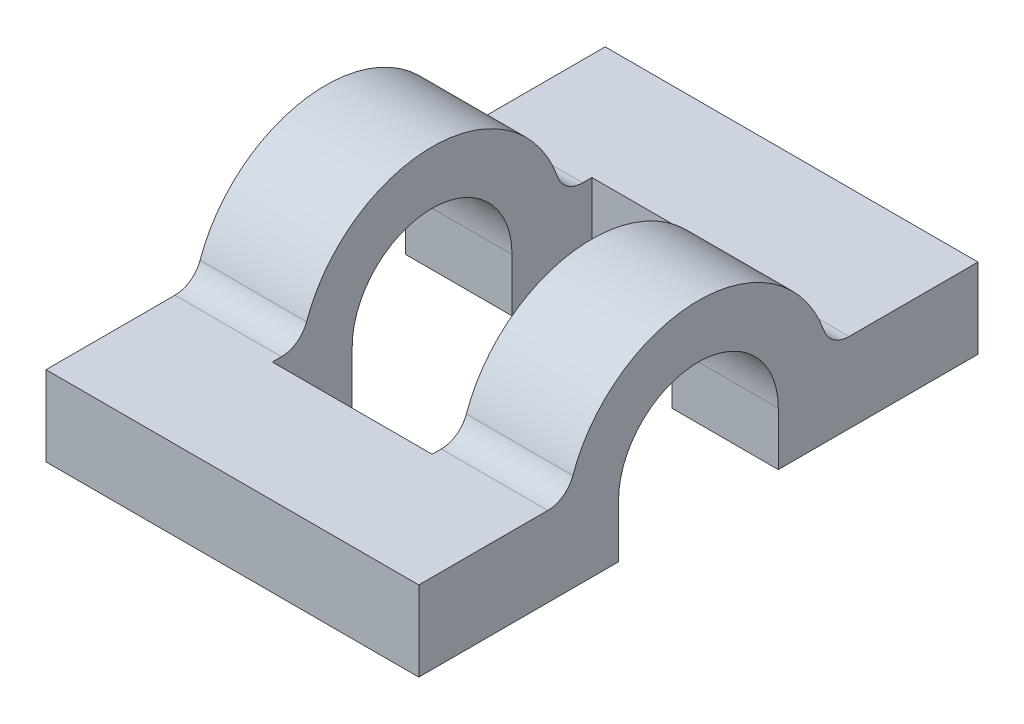
ISO-10303-21;
HEADER;
FILE_DESCRIPTION(('STEP AP214'),'2;1');
FILE_NAME('part.step','',(''),(''),'','','');
FILE_SCHEMA(('AUTOMOTIVE_DESIGN { 1 0 10303 214 1 1 1 1 }'));
ENDSEC;
DATA;
#1=APPLICATION_CONTEXT('core data for automotive mechanical design processes');
#2=APPLICATION_PROTOCOL_DEFINITION('international standard','automotive_design',2000,#1);
#3=PRODUCT_CONTEXT('',#1,'mechanical');
#4=PRODUCT('Part','Part','',(#3));
#5=PRODUCT_RELATED_PRODUCT_CATEGORY('part','',(#4));
#6=PRODUCT_DEFINITION_FORMATION('','',#4);
#7=PRODUCT_DEFINITION_CONTEXT('part definition',#1,'design');
#8=PRODUCT_DEFINITION('design','',#6,#7);
#9=PRODUCT_DEFINITION_SHAPE('','',#8);
#10=(LENGTH_UNIT() NAMED_UNIT(*) SI_UNIT(.MILLI.,.METRE.));
#11=(NAMED_UNIT(*) PLANE_ANGLE_UNIT() SI_UNIT($,.RADIAN.));
#12=(NAMED_UNIT(*) SI_UNIT($,.STERADIAN.) SOLID_ANGLE_UNIT());
#13=UNCERTAINTY_MEASURE_WITH_UNIT(LENGTH_MEASURE(1.E-05),#10,'distance_accuracy_value','');
#14=(GEOMETRIC_REPRESENTATION_CONTEXT(3) GLOBAL_UNCERTAINTY_ASSIGNED_CONTEXT((#13)) GLOBAL_UNIT_ASSIGNED_CONTEXT((#10,
#11,#12)) REPRESENTATION_CONTEXT('',''));
#15=CARTESIAN_POINT('',(0.,0.,0.));
#16=DIRECTION('',(0.,0.,1.));
#17=DIRECTION('',(1.,0.,0.));
#18=AXIS2_PLACEMENT_3D('',#15,#16,#17);
#19=CARTESIAN_POINT('',(14.,2.,0.));
#20=DIRECTION('',(-1.,0.,0.));
#21=DIRECTION('',(0.,0.,1.));
#22=AXIS2_PLACEMENT_3D('',#19,#20,#21);
#23=CYLINDRICAL_SURFACE('',#22,5.);
#24=CARTESIAN_POINT('',(10.,2.,0.));
#25=DIRECTION('',(1.,0.,0.));
#26=DIRECTION('',(0.,0.,-1.));
#27=AXIS2_PLACEMENT_3D('',#24,#25,#26);
#28=CIRCLE('',#27,5.);
#29=CARTESIAN_POINT('',(10.,3.66666666666667,-4.71404520791032));
#30=VERTEX_POINT('',#29);
#31=CARTESIAN_POINT('',(10.,3.66666666666667,4.71404520791032));
#32=VERTEX_POINT('',#31);
#33=EDGE_CURVE('E246',#30,#32,#28,.T.);
#34=ORIENTED_EDGE('',*,*,#33,.T.);
#35=DIRECTION('',(-1.,0.,0.));
#36=VECTOR('',#35,1.);
#37=CARTESIAN_POINT('',(14.,3.66666666666667,4.71404520791032));
#38=LINE('',#37,#36);
#39=CARTESIAN_POINT('',(14.,3.66666666666667,4.71404520791032));
#40=VERTEX_POINT('',#39);
#41=EDGE_CURVE('E360',#32,#40,#38,.F.);
#42=ORIENTED_EDGE('',*,*,#41,.T.);
#43=CARTESIAN_POINT('',(14.,2.,0.));
#44=DIRECTION('',(1.,0.,0.));
#45=DIRECTION('',(0.,0.,1.));
#46=AXIS2_PLACEMENT_3D('',#43,#44,#45);
#47=CIRCLE('',#46,5.);
#48=CARTESIAN_POINT('',(14.,3.66666666666667,-4.71404520791032));
#49=VERTEX_POINT('',#48);
#50=EDGE_CURVE('E277',#49,#40,#47,.T.);
#51=ORIENTED_EDGE('',*,*,#50,.F.);
#52=DIRECTION('',(-1.,0.,0.));
#53=VECTOR('',#52,1.);
#54=CARTESIAN_POINT('',(14.,3.66666666666667,-4.71404520791032));
#55=LINE('',#54,#53);
#56=EDGE_CURVE('E357',#49,#30,#55,.T.);
#57=ORIENTED_EDGE('',*,*,#56,.T.);
#58=EDGE_LOOP('',(#34,#42,#51,#57));
#59=FACE_BOUND('',#58,.T.);
#60=ADVANCED_FACE('F35',(#59),#23,.T.);
#61=CARTESIAN_POINT('',(14.,0.,3.));
#62=DIRECTION('',(0.,0.,1.));
#63=DIRECTION('',(1.,0.,0.));
#64=AXIS2_PLACEMENT_3D('',#61,#62,#63);
#65=PLANE('',#64);
#66=DIRECTION('',(-1.,0.,0.));
#67=VECTOR('',#66,1.);
#68=CARTESIAN_POINT('',(14.,2.,3.));
#69=LINE('',#68,#67);
#70=CARTESIAN_POINT('',(4.,2.,3.));
#71=VERTEX_POINT('',#70);
#72=CARTESIAN_POINT('',(0.,2.,3.));
#73=VERTEX_POINT('',#72);
#74=EDGE_CURVE('E327',#71,#73,#69,.T.);
#75=ORIENTED_EDGE('',*,*,#74,.F.);
#76=DIRECTION('',(0.,-1.,0.));
#77=VECTOR('',#76,1.);
#78=CARTESIAN_POINT('',(4.,0.,3.));
#79=LINE('',#78,#77);
#80=CARTESIAN_POINT('',(4.,0.,3.));
#81=VERTEX_POINT('',#80);
#82=EDGE_CURVE('E256',#71,#81,#79,.T.);
#83=ORIENTED_EDGE('',*,*,#82,.T.);
#84=DIRECTION('',(-1.,0.,0.));
#85=VECTOR('',#84,1.);
#86=CARTESIAN_POINT('',(14.,0.,3.));
#87=LINE('',#86,#85);
#88=CARTESIAN_POINT('',(0.,0.,3.));
#89=VERTEX_POINT('',#88);
#90=EDGE_CURVE('E331',#81,#89,#87,.T.);
#91=ORIENTED_EDGE('',*,*,#90,.T.);
#92=DIRECTION('',(0.,1.,0.));
#93=VECTOR('',#92,1.);
#94=CARTESIAN_POINT('',(0.,0.,3.));
#95=LINE('',#94,#93);
#96=EDGE_CURVE('E309',#89,#73,#95,.T.);
#97=ORIENTED_EDGE('',*,*,#96,.T.);
#98=EDGE_LOOP('',(#75,#83,#91,#97));
#99=FACE_BOUND('',#98,.T.);
#100=ADVANCED_FACE('F449',(#99),#65,.F.);
#101=CARTESIAN_POINT('',(14.,2.,0.));
#102=DIRECTION('',(-1.,0.,0.));
#103=DIRECTION('',(0.,0.,1.));
#104=AXIS2_PLACEMENT_3D('',#101,#102,#103);
#105=CYLINDRICAL_SURFACE('',#104,3.);
#106=DIRECTION('',(-1.,0.,0.));
#107=VECTOR('',#106,1.);
#108=CARTESIAN_POINT('',(14.,2.,-3.));
#109=LINE('',#108,#107);
#110=CARTESIAN_POINT('',(4.,2.,-3.));
#111=VERTEX_POINT('',#110);
#112=CARTESIAN_POINT('',(0.,2.,-3.));
#113=VERTEX_POINT('',#112);
#114=EDGE_CURVE('E323',#111,#113,#109,.T.);
#115=ORIENTED_EDGE('',*,*,#114,.F.);
#116=CARTESIAN_POINT('',(4.,2.,0.));
#117=DIRECTION('',(-1.,0.,0.));
#118=DIRECTION('',(0.,0.,1.));
#119=AXIS2_PLACEMENT_3D('',#116,#117,#118);
#120=CIRCLE('',#119,3.);
#121=EDGE_CURVE('E253',#111,#71,#120,.F.);
#122=ORIENTED_EDGE('',*,*,#121,.T.);
#123=ORIENTED_EDGE('',*,*,#74,.T.);
#124=CARTESIAN_POINT('',(0.,2.,0.));
#125=DIRECTION('',(-1.,0.,0.));
#126=DIRECTION('',(0.,0.,1.));
#127=AXIS2_PLACEMENT_3D('',#124,#125,#126);
#128=CIRCLE('',#127,3.);
#129=EDGE_CURVE('E312',#73,#113,#128,.T.);
#130=ORIENTED_EDGE('',*,*,#129,.T.);
#131=EDGE_LOOP('',(#115,#122,#123,#130));
#132=FACE_BOUND('',#131,.T.);
#133=ADVANCED_FACE('F457',(#132),#105,.F.);
#134=CARTESIAN_POINT('',(14.,0.,-3.));
#135=DIRECTION('',(0.,0.,-1.));
#136=DIRECTION('',(-1.,0.,0.));
#137=AXIS2_PLACEMENT_3D('',#134,#135,#136);
#138=PLANE('',#137);
#139=DIRECTION('',(-1.,0.,0.));
#140=VECTOR('',#139,1.);
#141=CARTESIAN_POINT('',(14.,0.,-3.));
#142=LINE('',#141,#140);
#143=CARTESIAN_POINT('',(4.,0.,-3.));
#144=VERTEX_POINT('',#143);
#145=CARTESIAN_POINT('',(0.,0.,-3.));
#146=VERTEX_POINT('',#145);
#147=EDGE_CURVE('E321',#144,#146,#142,.T.);
#148=ORIENTED_EDGE('',*,*,#147,.F.);
#149=DIRECTION('',(0.,1.,0.));
#150=VECTOR('',#149,1.);
#151=CARTESIAN_POINT('',(4.,0.,-3.));
#152=LINE('',#151,#150);
#153=EDGE_CURVE('E250',#144,#111,#152,.T.);
#154=ORIENTED_EDGE('',*,*,#153,.T.);
#155=ORIENTED_EDGE('',*,*,#114,.T.);
#156=DIRECTION('',(0.,-1.,0.));
#157=VECTOR('',#156,1.);
#158=CARTESIAN_POINT('',(0.,0.,-3.));
#159=LINE('',#158,#157);
#160=EDGE_CURVE('E315',#113,#146,#159,.T.);
#161=ORIENTED_EDGE('',*,*,#160,.T.);
#162=EDGE_LOOP('',(#148,#154,#155,#161));
#163=FACE_BOUND('',#162,.T.);
#164=ADVANCED_FACE('F460',(#163),#138,.F.);
#165=CARTESIAN_POINT('',(14.,0.,-10.5));
#166=DIRECTION('',(0.,0.,1.));
#167=DIRECTION('',(0.,-1.,0.));
#168=AXIS2_PLACEMENT_3D('',#165,#166,#167);
#169=PLANE('',#168);
#170=DIRECTION('',(0.,1.,0.));
#171=VECTOR('',#170,1.);
#172=CARTESIAN_POINT('',(0.,0.,-10.5));
#173=LINE('',#172,#171);
#174=CARTESIAN_POINT('',(0.,0.,-10.5));
#175=VERTEX_POINT('',#174);
#176=CARTESIAN_POINT('',(0.,3.,-10.5));
#177=VERTEX_POINT('',#176);
#178=EDGE_CURVE('E270',#175,#177,#173,.T.);
#179=ORIENTED_EDGE('',*,*,#178,.T.);
#180=DIRECTION('',(-1.,0.,0.));
#181=VECTOR('',#180,1.);
#182=CARTESIAN_POINT('',(14.,3.,-10.5));
#183=LINE('',#182,#181);
#184=CARTESIAN_POINT('',(14.,3.,-10.5));
#185=VERTEX_POINT('',#184);
#186=EDGE_CURVE('E341',#185,#177,#183,.T.);
#187=ORIENTED_EDGE('',*,*,#186,.F.);
#188=DIRECTION('',(0.,1.,0.));
#189=VECTOR('',#188,1.);
#190=CARTESIAN_POINT('',(14.,0.,-10.5));
#191=LINE('',#190,#189);
#192=CARTESIAN_POINT('',(14.,0.,-10.5));
#193=VERTEX_POINT('',#192);
#194=EDGE_CURVE('E271',#193,#185,#191,.T.);
#195=ORIENTED_EDGE('',*,*,#194,.F.);
#196=DIRECTION('',(-1.,0.,0.));
#197=VECTOR('',#196,1.);
#198=CARTESIAN_POINT('',(14.,0.,-10.5));
#199=LINE('',#198,#197);
#200=EDGE_CURVE('E294',#193,#175,#199,.T.);
#201=ORIENTED_EDGE('',*,*,#200,.T.);
#202=EDGE_LOOP('',(#179,#187,#195,#201));
#203=FACE_BOUND('',#202,.T.);
#204=ADVANCED_FACE('F424',(#203),#169,.F.);
#205=CARTESIAN_POINT('',(14.,3.,-10.5));
#206=DIRECTION('',(0.,-1.,0.));
#207=DIRECTION('',(0.,0.,-1.));
#208=AXIS2_PLACEMENT_3D('',#205,#206,#207);
#209=PLANE('',#208);
#210=DIRECTION('',(0.,0.,1.));
#211=VECTOR('',#210,1.);
#212=CARTESIAN_POINT('',(0.,3.,-10.5));
#213=LINE('',#212,#211);
#214=CARTESIAN_POINT('',(0.,3.,-5.65685424949238));
#215=VERTEX_POINT('',#214);
#216=EDGE_CURVE('E297',#177,#215,#213,.T.);
#217=ORIENTED_EDGE('',*,*,#216,.T.);
#218=DIRECTION('',(1.,0.,0.));
#219=VECTOR('',#218,1.);
#220=CARTESIAN_POINT('',(4.,3.,-5.65685424949238));
#221=LINE('',#220,#219);
#222=CARTESIAN_POINT('',(4.,3.,-5.65685424949238));
#223=VERTEX_POINT('',#222);
#224=EDGE_CURVE('E363',#215,#223,#221,.T.);
#225=ORIENTED_EDGE('',*,*,#224,.T.);
#226=DIRECTION('',(0.,0.,-1.));
#227=VECTOR('',#226,1.);
#228=CARTESIAN_POINT('',(4.,3.,-10.5));
#229=LINE('',#228,#227);
#230=CARTESIAN_POINT('',(4.,3.,-6.));
#231=VERTEX_POINT('',#230);
#232=EDGE_CURVE('E265',#223,#231,#229,.T.);
#233=ORIENTED_EDGE('',*,*,#232,.T.);
#234=DIRECTION('',(1.,0.,0.));
#235=VECTOR('',#234,1.);
#236=CARTESIAN_POINT('',(14.,3.,-6.));
#237=LINE('',#236,#235);
#238=CARTESIAN_POINT('',(10.,3.,-6.));
#239=VERTEX_POINT('',#238);
#240=EDGE_CURVE('E232',#231,#239,#237,.T.);
#241=ORIENTED_EDGE('',*,*,#240,.T.);
#242=DIRECTION('',(0.,0.,1.));
#243=VECTOR('',#242,1.);
#244=CARTESIAN_POINT('',(10.,3.,-10.5));
#245=LINE('',#244,#243);
#246=CARTESIAN_POINT('',(10.,3.,-5.65685424949238));
#247=VERTEX_POINT('',#246);
#248=EDGE_CURVE('E201',#239,#247,#245,.T.);
#249=ORIENTED_EDGE('',*,*,#248,.T.);
#250=DIRECTION('',(1.,0.,0.));
#251=VECTOR('',#250,1.);
#252=CARTESIAN_POINT('',(14.,3.,-5.65685424949238));
#253=LINE('',#252,#251);
#254=CARTESIAN_POINT('',(14.,3.,-5.65685424949238));
#255=VERTEX_POINT('',#254);
#256=EDGE_CURVE('E58',#247,#255,#253,.T.);
#257=ORIENTED_EDGE('',*,*,#256,.T.);
#258=DIRECTION('',(0.,0.,1.));
#259=VECTOR('',#258,1.);
#260=CARTESIAN_POINT('',(14.,3.,-10.5));
#261=LINE('',#260,#259);
#262=EDGE_CURVE('E274',#185,#255,#261,.T.);
#263=ORIENTED_EDGE('',*,*,#262,.F.);
#264=ORIENTED_EDGE('',*,*,#186,.T.);
#265=EDGE_LOOP('',(#217,#225,#233,#241,#249,#257,#263,#264));
#266=FACE_BOUND('',#265,.T.);
#267=ADVANCED_FACE('F378',(#266),#209,.F.);
#268=CARTESIAN_POINT('',(0.,2.,0.));
#269=DIRECTION('',(1.,0.,0.));
#270=DIRECTION('',(0.,0.,1.));
#271=AXIS2_PLACEMENT_3D('',#268,#269,#270);
#272=CIRCLE('',#271,5.);
#273=CARTESIAN_POINT('',(0.,3.66666666666667,-4.71404520791032));
#274=VERTEX_POINT('',#273);
#275=CARTESIAN_POINT('',(0.,3.66666666666667,4.71404520791032));
#276=VERTEX_POINT('',#275);
#277=EDGE_CURVE('E299',#274,#276,#272,.T.);
#278=ORIENTED_EDGE('',*,*,#277,.T.);
#279=DIRECTION('',(-1.,0.,0.));
#280=VECTOR('',#279,1.);
#281=CARTESIAN_POINT('',(14.,3.66666666666667,4.71404520791032));
#282=LINE('',#281,#280);
#283=CARTESIAN_POINT('',(4.,3.66666666666667,4.71404520791032));
#284=VERTEX_POINT('',#283);
#285=EDGE_CURVE('E355',#276,#284,#282,.F.);
#286=ORIENTED_EDGE('',*,*,#285,.T.);
#287=CARTESIAN_POINT('',(4.,2.,0.));
#288=DIRECTION('',(-1.,0.,0.));
#289=DIRECTION('',(0.,0.,1.));
#290=AXIS2_PLACEMENT_3D('',#287,#288,#289);
#291=CIRCLE('',#290,5.);
#292=CARTESIAN_POINT('',(4.,3.66666666666667,-4.71404520791032));
#293=VERTEX_POINT('',#292);
#294=EDGE_CURVE('E262',#284,#293,#291,.T.);
#295=ORIENTED_EDGE('',*,*,#294,.T.);
#296=DIRECTION('',(-1.,0.,0.));
#297=VECTOR('',#296,1.);
#298=CARTESIAN_POINT('',(14.,3.66666666666667,-4.71404520791032));
#299=LINE('',#298,#297);
#300=EDGE_CURVE('E352',#293,#274,#299,.T.);
#301=ORIENTED_EDGE('',*,*,#300,.T.);
#302=EDGE_LOOP('',(#278,#286,#295,#301));
#303=FACE_BOUND('',#302,.T.);
#304=ADVANCED_FACE('F436',(#303),#23,.T.);
#305=CARTESIAN_POINT('',(14.,3.,4.89897948556636));
#306=DIRECTION('',(0.,-1.,0.));
#307=DIRECTION('',(0.,0.,-1.));
#308=AXIS2_PLACEMENT_3D('',#305,#306,#307);
#309=PLANE('',#308);
#310=DIRECTION('',(0.,0.,-1.));
#311=VECTOR('',#310,1.);
#312=CARTESIAN_POINT('',(4.,3.,4.89897948556635));
#313=LINE('',#312,#311);
#314=CARTESIAN_POINT('',(4.,3.,6.));
#315=VERTEX_POINT('',#314);
#316=CARTESIAN_POINT('',(4.,3.,5.65685424949238));
#317=VERTEX_POINT('',#316);
#318=EDGE_CURVE('E259',#315,#317,#313,.T.);
#319=ORIENTED_EDGE('',*,*,#318,.T.);
#320=DIRECTION('',(1.,0.,0.));
#321=VECTOR('',#320,1.);
#322=CARTESIAN_POINT('',(0.,3.,5.65685424949238));
#323=LINE('',#322,#321);
#324=CARTESIAN_POINT('',(0.,3.,5.65685424949238));
#325=VERTEX_POINT('',#324);
#326=EDGE_CURVE('E349',#317,#325,#323,.F.);
#327=ORIENTED_EDGE('',*,*,#326,.T.);
#328=DIRECTION('',(0.,0.,1.));
#329=VECTOR('',#328,1.);
#330=CARTESIAN_POINT('',(0.,3.,4.89897948556636));
#331=LINE('',#330,#329);
#332=CARTESIAN_POINT('',(0.,3.,10.5));
#333=VERTEX_POINT('',#332);
#334=EDGE_CURVE('E302',#325,#333,#331,.T.);
#335=ORIENTED_EDGE('',*,*,#334,.T.);
#336=DIRECTION('',(-1.,0.,0.));
#337=VECTOR('',#336,1.);
#338=CARTESIAN_POINT('',(14.,3.,10.5));
#339=LINE('',#338,#337);
#340=CARTESIAN_POINT('',(14.,3.,10.5));
#341=VERTEX_POINT('',#340);
#342=EDGE_CURVE('E338',#341,#333,#339,.T.);
#343=ORIENTED_EDGE('',*,*,#342,.F.);
#344=DIRECTION('',(0.,0.,1.));
#345=VECTOR('',#344,1.);
#346=CARTESIAN_POINT('',(14.,3.,4.89897948556636));
#347=LINE('',#346,#345);
#348=CARTESIAN_POINT('',(14.,3.,5.65685424949238));
#349=VERTEX_POINT('',#348);
#350=EDGE_CURVE('E280',#349,#341,#347,.T.);
#351=ORIENTED_EDGE('',*,*,#350,.F.);
#352=DIRECTION('',(1.,0.,0.));
#353=VECTOR('',#352,1.);
#354=CARTESIAN_POINT('',(10.,3.,5.65685424949238));
#355=LINE('',#354,#353);
#356=CARTESIAN_POINT('',(10.,3.,5.65685424949238));
#357=VERTEX_POINT('',#356);
#358=EDGE_CURVE('E346',#349,#357,#355,.F.);
#359=ORIENTED_EDGE('',*,*,#358,.T.);
#360=DIRECTION('',(0.,0.,1.));
#361=VECTOR('',#360,1.);
#362=CARTESIAN_POINT('',(10.,3.,4.89897948556636));
#363=LINE('',#362,#361);
#364=CARTESIAN_POINT('',(10.,3.,6.));
#365=VERTEX_POINT('',#364);
#366=EDGE_CURVE('E244',#357,#365,#363,.T.);
#367=ORIENTED_EDGE('',*,*,#366,.T.);
#368=DIRECTION('',(-1.,0.,0.));
#369=VECTOR('',#368,1.);
#370=CARTESIAN_POINT('',(14.,3.,6.));
#371=LINE('',#370,#369);
#372=EDGE_CURVE('E267',#365,#315,#371,.T.);
#373=ORIENTED_EDGE('',*,*,#372,.T.);
#374=EDGE_LOOP('',(#319,#327,#335,#343,#351,#359,#367,#373));
#375=FACE_BOUND('',#374,.T.);
#376=ADVANCED_FACE('F392',(#375),#309,.F.);
#377=CARTESIAN_POINT('',(14.,3.,10.5));
#378=DIRECTION('',(0.,0.,-1.));
#379=DIRECTION('',(-1.,0.,0.));
#380=AXIS2_PLACEMENT_3D('',#377,#378,#379);
#381=PLANE('',#380);
#382=DIRECTION('',(0.,-1.,0.));
#383=VECTOR('',#382,1.);
#384=CARTESIAN_POINT('',(0.,3.,10.5));
#385=LINE('',#384,#383);
#386=CARTESIAN_POINT('',(0.,0.,10.5));
#387=VERTEX_POINT('',#386);
#388=EDGE_CURVE('E304',#333,#387,#385,.T.);
#389=ORIENTED_EDGE('',*,*,#388,.T.);
#390=DIRECTION('',(-1.,0.,0.));
#391=VECTOR('',#390,1.);
#392=CARTESIAN_POINT('',(14.,0.,10.5));
#393=LINE('',#392,#391);
#394=CARTESIAN_POINT('',(14.,0.,10.5));
#395=VERTEX_POINT('',#394);
#396=EDGE_CURVE('E335',#395,#387,#393,.T.);
#397=ORIENTED_EDGE('',*,*,#396,.F.);
#398=DIRECTION('',(0.,-1.,0.));
#399=VECTOR('',#398,1.);
#400=CARTESIAN_POINT('',(14.,3.,10.5));
#401=LINE('',#400,#399);
#402=EDGE_CURVE('E282',#341,#395,#401,.T.);
#403=ORIENTED_EDGE('',*,*,#402,.F.);
#404=ORIENTED_EDGE('',*,*,#342,.T.);
#405=EDGE_LOOP('',(#389,#397,#403,#404));
#406=FACE_BOUND('',#405,.T.);
#407=ADVANCED_FACE('F399',(#406),#381,.F.);
#408=CARTESIAN_POINT('',(14.,0.,10.5));
#409=DIRECTION('',(0.,1.,0.));
#410=DIRECTION('',(0.,0.,1.));
#411=AXIS2_PLACEMENT_3D('',#408,#409,#410);
#412=PLANE('',#411);
#413=ORIENTED_EDGE('',*,*,#90,.F.);
#414=DIRECTION('',(0.,0.,-1.));
#415=VECTOR('',#414,1.);
#416=CARTESIAN_POINT('',(4.,0.,6.));
#417=LINE('',#416,#415);
#418=CARTESIAN_POINT('',(4.,0.,6.));
#419=VERTEX_POINT('',#418);
#420=EDGE_CURVE('E216',#419,#81,#417,.T.);
#421=ORIENTED_EDGE('',*,*,#420,.F.);
#422=DIRECTION('',(-1.,0.,0.));
#423=VECTOR('',#422,1.);
#424=CARTESIAN_POINT('',(4.,0.,6.));
#425=LINE('',#424,#423);
#426=CARTESIAN_POINT('',(10.,0.,6.));
#427=VERTEX_POINT('',#426);
#428=EDGE_CURVE('E223',#427,#419,#425,.T.);
#429=ORIENTED_EDGE('',*,*,#428,.F.);
#430=DIRECTION('',(0.,0.,1.));
#431=VECTOR('',#430,1.);
#432=CARTESIAN_POINT('',(10.,0.,6.));
#433=LINE('',#432,#431);
#434=CARTESIAN_POINT('',(10.,0.,3.));
#435=VERTEX_POINT('',#434);
#436=EDGE_CURVE('E215',#435,#427,#433,.T.);
#437=ORIENTED_EDGE('',*,*,#436,.F.);
#438=CARTESIAN_POINT('',(14.,0.,3.));
#439=VERTEX_POINT('',#438);
#440=EDGE_CURVE('E332',#439,#435,#87,.T.);
#441=ORIENTED_EDGE('',*,*,#440,.F.);
#442=DIRECTION('',(0.,0.,-1.));
#443=VECTOR('',#442,1.);
#444=CARTESIAN_POINT('',(14.,0.,10.5));
#445=LINE('',#444,#443);
#446=EDGE_CURVE('E284',#395,#439,#445,.T.);
#447=ORIENTED_EDGE('',*,*,#446,.F.);
#448=ORIENTED_EDGE('',*,*,#396,.T.);
#449=DIRECTION('',(0.,0.,-1.));
#450=VECTOR('',#449,1.);
#451=CARTESIAN_POINT('',(0.,0.,10.5));
#452=LINE('',#451,#450);
#453=EDGE_CURVE('E306',#387,#89,#452,.T.);
#454=ORIENTED_EDGE('',*,*,#453,.T.);
#455=EDGE_LOOP('',(#413,#421,#429,#437,#441,#447,#448,#454));
#456=FACE_BOUND('',#455,.T.);
#457=ADVANCED_FACE('F407',(#456),#412,.F.);
#458=ORIENTED_EDGE('',*,*,#440,.T.);
#459=DIRECTION('',(0.,1.,0.));
#460=VECTOR('',#459,1.);
#461=CARTESIAN_POINT('',(10.,0.,3.));
#462=LINE('',#461,#460);
#463=CARTESIAN_POINT('',(10.,2.,3.));
#464=VERTEX_POINT('',#463);
#465=EDGE_CURVE('E241',#435,#464,#462,.T.);
#466=ORIENTED_EDGE('',*,*,#465,.T.);
#467=CARTESIAN_POINT('',(14.,2.,3.));
#468=VERTEX_POINT('',#467);
#469=EDGE_CURVE('E328',#468,#464,#69,.T.);
#470=ORIENTED_EDGE('',*,*,#469,.F.);
#471=DIRECTION('',(0.,1.,0.));
#472=VECTOR('',#471,1.);
#473=CARTESIAN_POINT('',(14.,0.,3.));
#474=LINE('',#473,#472);
#475=EDGE_CURVE('E286',#439,#468,#474,.T.);
#476=ORIENTED_EDGE('',*,*,#475,.F.);
#477=EDGE_LOOP('',(#458,#466,#470,#476));
#478=FACE_BOUND('',#477,.T.);
#479=ADVANCED_FACE('F410',(#478),#65,.F.);
#480=ORIENTED_EDGE('',*,*,#469,.T.);
#481=CARTESIAN_POINT('',(10.,2.,0.));
#482=DIRECTION('',(1.,0.,0.));
#483=DIRECTION('',(0.,0.,-1.));
#484=AXIS2_PLACEMENT_3D('',#481,#482,#483);
#485=CIRCLE('',#484,3.);
#486=CARTESIAN_POINT('',(10.,2.,-3.));
#487=VERTEX_POINT('',#486);
#488=EDGE_CURVE('E238',#464,#487,#485,.F.);
#489=ORIENTED_EDGE('',*,*,#488,.T.);
#490=CARTESIAN_POINT('',(14.,2.,-3.));
#491=VERTEX_POINT('',#490);
#492=EDGE_CURVE('E324',#491,#487,#109,.T.);
#493=ORIENTED_EDGE('',*,*,#492,.F.);
#494=CARTESIAN_POINT('',(14.,2.,0.));
#495=DIRECTION('',(-1.,0.,0.));
#496=DIRECTION('',(0.,0.,1.));
#497=AXIS2_PLACEMENT_3D('',#494,#495,#496);
#498=CIRCLE('',#497,3.);
#499=EDGE_CURVE('E288',#468,#491,#498,.T.);
#500=ORIENTED_EDGE('',*,*,#499,.F.);
#501=EDGE_LOOP('',(#480,#489,#493,#500));
#502=FACE_BOUND('',#501,.T.);
#503=ADVANCED_FACE('F414',(#502),#105,.F.);
#504=ORIENTED_EDGE('',*,*,#492,.T.);
#505=DIRECTION('',(0.,-1.,0.));
#506=VECTOR('',#505,1.);
#507=CARTESIAN_POINT('',(10.,0.,-3.));
#508=LINE('',#507,#506);
#509=CARTESIAN_POINT('',(10.,0.,-3.));
#510=VERTEX_POINT('',#509);
#511=EDGE_CURVE('E236',#487,#510,#508,.T.);
#512=ORIENTED_EDGE('',*,*,#511,.T.);
#513=CARTESIAN_POINT('',(14.,0.,-3.));
#514=VERTEX_POINT('',#513);
#515=EDGE_CURVE('E222',#514,#510,#142,.T.);
#516=ORIENTED_EDGE('',*,*,#515,.F.);
#517=DIRECTION('',(0.,-1.,0.));
#518=VECTOR('',#517,1.);
#519=CARTESIAN_POINT('',(14.,0.,-3.));
#520=LINE('',#519,#518);
#521=EDGE_CURVE('E290',#491,#514,#520,.T.);
#522=ORIENTED_EDGE('',*,*,#521,.F.);
#523=EDGE_LOOP('',(#504,#512,#516,#522));
#524=FACE_BOUND('',#523,.T.);
#525=ADVANCED_FACE('F418',(#524),#138,.F.);
#526=CARTESIAN_POINT('',(14.,0.,-10.5));
#527=DIRECTION('',(0.,1.,0.));
#528=DIRECTION('',(0.,0.,1.));
#529=AXIS2_PLACEMENT_3D('',#526,#527,#528);
#530=PLANE('',#529);
#531=DIRECTION('',(1.,0.,0.));
#532=VECTOR('',#531,1.);
#533=CARTESIAN_POINT('',(4.,0.,-6.));
#534=LINE('',#533,#532);
#535=CARTESIAN_POINT('',(4.,0.,-6.));
#536=VERTEX_POINT('',#535);
#537=CARTESIAN_POINT('',(10.,0.,-6.));
#538=VERTEX_POINT('',#537);
#539=EDGE_CURVE('E209',#536,#538,#534,.T.);
#540=ORIENTED_EDGE('',*,*,#539,.F.);
#541=DIRECTION('',(0.,0.,1.));
#542=VECTOR('',#541,1.);
#543=CARTESIAN_POINT('',(4.,0.,-10.5));
#544=LINE('',#543,#542);
#545=EDGE_CURVE('E344',#536,#144,#544,.T.);
#546=ORIENTED_EDGE('',*,*,#545,.T.);
#547=ORIENTED_EDGE('',*,*,#147,.T.);
#548=DIRECTION('',(0.,0.,-1.));
#549=VECTOR('',#548,1.);
#550=CARTESIAN_POINT('',(0.,0.,-10.5));
#551=LINE('',#550,#549);
#552=EDGE_CURVE('E275',#146,#175,#551,.T.);
#553=ORIENTED_EDGE('',*,*,#552,.T.);
#554=ORIENTED_EDGE('',*,*,#200,.F.);
#555=DIRECTION('',(0.,0.,-1.));
#556=VECTOR('',#555,1.);
#557=CARTESIAN_POINT('',(14.,0.,-10.5));
#558=LINE('',#557,#556);
#559=EDGE_CURVE('E292',#514,#193,#558,.T.);
#560=ORIENTED_EDGE('',*,*,#559,.F.);
#561=ORIENTED_EDGE('',*,*,#515,.T.);
#562=EDGE_CURVE('E199',#538,#510,#433,.T.);
#563=ORIENTED_EDGE('',*,*,#562,.F.);
#564=EDGE_LOOP('',(#540,#546,#547,#553,#554,#560,#561,#563));
#565=FACE_BOUND('',#564,.T.);
#566=ADVANCED_FACE('F219',(#565),#530,.F.);
#567=CARTESIAN_POINT('',(14.,2.,0.));
#568=DIRECTION('',(-1.,0.,0.));
#569=DIRECTION('',(0.,0.,1.));
#570=AXIS2_PLACEMENT_3D('',#567,#568,#569);
#571=PLANE('',#570);
#572=ORIENTED_EDGE('',*,*,#194,.T.);
#573=ORIENTED_EDGE('',*,*,#262,.T.);
#574=CARTESIAN_POINT('',(14.,4.,-5.65685424949238));
#575=DIRECTION('',(-1.,0.,0.));
#576=DIRECTION('',(0.,0.,1.));
#577=AXIS2_PLACEMENT_3D('',#574,#575,#576);
#578=CIRCLE('',#577,1.);
#579=EDGE_CURVE('E11',#255,#49,#578,.T.);
#580=ORIENTED_EDGE('',*,*,#579,.T.);
#581=ORIENTED_EDGE('',*,*,#50,.T.);
#582=CARTESIAN_POINT('',(14.,4.,5.65685424949238));
#583=DIRECTION('',(-1.,0.,0.));
#584=DIRECTION('',(0.,0.,1.));
#585=AXIS2_PLACEMENT_3D('',#582,#583,#584);
#586=CIRCLE('',#585,1.);
#587=EDGE_CURVE('E371',#40,#349,#586,.T.);
#588=ORIENTED_EDGE('',*,*,#587,.T.);
#589=ORIENTED_EDGE('',*,*,#350,.T.);
#590=ORIENTED_EDGE('',*,*,#402,.T.);
#591=ORIENTED_EDGE('',*,*,#446,.T.);
#592=ORIENTED_EDGE('',*,*,#475,.T.);
#593=ORIENTED_EDGE('',*,*,#499,.T.);
#594=ORIENTED_EDGE('',*,*,#521,.T.);
#595=ORIENTED_EDGE('',*,*,#559,.T.);
#596=EDGE_LOOP('',(#572,#573,#580,#581,#588,#589,#590,#591,#592,#593,#594,#595));
#597=FACE_BOUND('',#596,.T.);
#598=ADVANCED_FACE('F382',(#597),#571,.F.);
#599=CARTESIAN_POINT('',(0.,2.,0.));
#600=DIRECTION('',(-1.,0.,0.));
#601=DIRECTION('',(0.,0.,1.));
#602=AXIS2_PLACEMENT_3D('',#599,#600,#601);
#603=PLANE('',#602);
#604=ORIENTED_EDGE('',*,*,#178,.F.);
#605=ORIENTED_EDGE('',*,*,#552,.F.);
#606=ORIENTED_EDGE('',*,*,#160,.F.);
#607=ORIENTED_EDGE('',*,*,#129,.F.);
#608=ORIENTED_EDGE('',*,*,#96,.F.);
#609=ORIENTED_EDGE('',*,*,#453,.F.);
#610=ORIENTED_EDGE('',*,*,#388,.F.);
#611=ORIENTED_EDGE('',*,*,#334,.F.);
#612=CARTESIAN_POINT('',(0.,4.,5.65685424949238));
#613=DIRECTION('',(-1.,0.,0.));
#614=DIRECTION('',(0.,0.,1.));
#615=AXIS2_PLACEMENT_3D('',#612,#613,#614);
#616=CIRCLE('',#615,1.);
#617=EDGE_CURVE('E365',#325,#276,#616,.F.);
#618=ORIENTED_EDGE('',*,*,#617,.T.);
#619=ORIENTED_EDGE('',*,*,#277,.F.);
#620=CARTESIAN_POINT('',(0.,4.,-5.65685424949238));
#621=DIRECTION('',(-1.,0.,0.));
#622=DIRECTION('',(0.,0.,1.));
#623=AXIS2_PLACEMENT_3D('',#620,#621,#622);
#624=CIRCLE('',#623,1.);
#625=EDGE_CURVE('E50',#274,#215,#624,.F.);
#626=ORIENTED_EDGE('',*,*,#625,.T.);
#627=ORIENTED_EDGE('',*,*,#216,.F.);
#628=EDGE_LOOP('',(#604,#605,#606,#607,#608,#609,#610,#611,#618,#619,#626,#627));
#629=FACE_BOUND('',#628,.T.);
#630=ADVANCED_FACE('F453',(#629),#603,.T.);
#631=CARTESIAN_POINT('',(4.,7.,6.));
#632=DIRECTION('',(0.,0.,1.));
#633=DIRECTION('',(1.,0.,0.));
#634=AXIS2_PLACEMENT_3D('',#631,#632,#633);
#635=PLANE('',#634);
#636=DIRECTION('',(0.,-1.,0.));
#637=VECTOR('',#636,1.);
#638=CARTESIAN_POINT('',(10.,7.,6.));
#639=LINE('',#638,#637);
#640=EDGE_CURVE('E205',#365,#427,#639,.T.);
#641=ORIENTED_EDGE('',*,*,#640,.T.);
#642=ORIENTED_EDGE('',*,*,#428,.T.);
#643=DIRECTION('',(0.,-1.,0.));
#644=VECTOR('',#643,1.);
#645=CARTESIAN_POINT('',(4.,7.,6.));
#646=LINE('',#645,#644);
#647=EDGE_CURVE('E230',#315,#419,#646,.T.);
#648=ORIENTED_EDGE('',*,*,#647,.F.);
#649=ORIENTED_EDGE('',*,*,#372,.F.);
#650=EDGE_LOOP('',(#641,#642,#648,#649));
#651=FACE_BOUND('',#650,.T.);
#652=ADVANCED_FACE('F445',(#651),#635,.F.);
#653=CARTESIAN_POINT('',(4.,7.,6.));
#654=DIRECTION('',(-1.,0.,0.));
#655=DIRECTION('',(0.,0.,1.));
#656=AXIS2_PLACEMENT_3D('',#653,#654,#655);
#657=PLANE('',#656);
#658=ORIENTED_EDGE('',*,*,#294,.F.);
#659=CARTESIAN_POINT('',(4.,4.,5.65685424949238));
#660=DIRECTION('',(-1.,0.,0.));
#661=DIRECTION('',(0.,0.,1.));
#662=AXIS2_PLACEMENT_3D('',#659,#660,#661);
#663=CIRCLE('',#662,1.);
#664=EDGE_CURVE('E367',#284,#317,#663,.T.);
#665=ORIENTED_EDGE('',*,*,#664,.T.);
#666=ORIENTED_EDGE('',*,*,#318,.F.);
#667=ORIENTED_EDGE('',*,*,#647,.T.);
#668=ORIENTED_EDGE('',*,*,#420,.T.);
#669=ORIENTED_EDGE('',*,*,#82,.F.);
#670=ORIENTED_EDGE('',*,*,#121,.F.);
#671=ORIENTED_EDGE('',*,*,#153,.F.);
#672=ORIENTED_EDGE('',*,*,#545,.F.);
#673=DIRECTION('',(0.,-1.,0.));
#674=VECTOR('',#673,1.);
#675=CARTESIAN_POINT('',(4.,7.,-6.));
#676=LINE('',#675,#674);
#677=EDGE_CURVE('E206',#231,#536,#676,.T.);
#678=ORIENTED_EDGE('',*,*,#677,.F.);
#679=ORIENTED_EDGE('',*,*,#232,.F.);
#680=CARTESIAN_POINT('',(4.,4.,-5.65685424949238));
#681=DIRECTION('',(-1.,0.,0.));
#682=DIRECTION('',(0.,0.,1.));
#683=AXIS2_PLACEMENT_3D('',#680,#681,#682);
#684=CIRCLE('',#683,1.);
#685=EDGE_CURVE('E374',#223,#293,#684,.T.);
#686=ORIENTED_EDGE('',*,*,#685,.T.);
#687=EDGE_LOOP('',(#658,#665,#666,#667,#668,#669,#670,#671,#672,#678,#679,#686));
#688=FACE_BOUND('',#687,.T.);
#689=ADVANCED_FACE('F433',(#688),#657,.F.);
#690=CARTESIAN_POINT('',(10.,7.,6.));
#691=DIRECTION('',(1.,0.,0.));
#692=DIRECTION('',(0.,0.,-1.));
#693=AXIS2_PLACEMENT_3D('',#690,#691,#692);
#694=PLANE('',#693);
#695=DIRECTION('',(0.,-1.,0.));
#696=VECTOR('',#695,1.);
#697=CARTESIAN_POINT('',(10.,7.,-6.));
#698=LINE('',#697,#696);
#699=EDGE_CURVE('E195',#239,#538,#698,.T.);
#700=ORIENTED_EDGE('',*,*,#699,.T.);
#701=ORIENTED_EDGE('',*,*,#562,.T.);
#702=ORIENTED_EDGE('',*,*,#511,.F.);
#703=ORIENTED_EDGE('',*,*,#488,.F.);
#704=ORIENTED_EDGE('',*,*,#465,.F.);
#705=ORIENTED_EDGE('',*,*,#436,.T.);
#706=ORIENTED_EDGE('',*,*,#640,.F.);
#707=ORIENTED_EDGE('',*,*,#366,.F.);
#708=CARTESIAN_POINT('',(10.,4.,5.65685424949238));
#709=DIRECTION('',(1.,0.,0.));
#710=DIRECTION('',(0.,0.,-1.));
#711=AXIS2_PLACEMENT_3D('',#708,#709,#710);
#712=CIRCLE('',#711,1.);
#713=EDGE_CURVE('E369',#357,#32,#712,.T.);
#714=ORIENTED_EDGE('',*,*,#713,.T.);
#715=ORIENTED_EDGE('',*,*,#33,.F.);
#716=CARTESIAN_POINT('',(10.,4.,-5.65685424949238));
#717=DIRECTION('',(1.,0.,0.));
#718=DIRECTION('',(0.,0.,-1.));
#719=AXIS2_PLACEMENT_3D('',#716,#717,#718);
#720=CIRCLE('',#719,1.);
#721=EDGE_CURVE('E43',#30,#247,#720,.T.);
#722=ORIENTED_EDGE('',*,*,#721,.T.);
#723=ORIENTED_EDGE('',*,*,#248,.F.);
#724=EDGE_LOOP('',(#700,#701,#702,#703,#704,#705,#706,#707,#714,#715,#722,#723));
#725=FACE_BOUND('',#724,.T.);
#726=ADVANCED_FACE('F197',(#725),#694,.F.);
#727=CARTESIAN_POINT('',(4.,7.,-6.));
#728=DIRECTION('',(0.,0.,-1.));
#729=DIRECTION('',(0.,1.,0.));
#730=AXIS2_PLACEMENT_3D('',#727,#728,#729);
#731=PLANE('',#730);
#732=ORIENTED_EDGE('',*,*,#677,.T.);
#733=ORIENTED_EDGE('',*,*,#539,.T.);
#734=ORIENTED_EDGE('',*,*,#699,.F.);
#735=ORIENTED_EDGE('',*,*,#240,.F.);
#736=EDGE_LOOP('',(#732,#733,#734,#735));
#737=FACE_BOUND('',#736,.T.);
#738=ADVANCED_FACE('F210',(#737),#731,.F.);
#739=CARTESIAN_POINT('',(14.,4.,5.65685424949238));
#740=DIRECTION('',(-1.,0.,0.));
#741=DIRECTION('',(0.,0.,1.));
#742=AXIS2_PLACEMENT_3D('',#739,#740,#741);
#743=CYLINDRICAL_SURFACE('',#742,1.);
#744=ORIENTED_EDGE('',*,*,#664,.F.);
#745=ORIENTED_EDGE('',*,*,#285,.F.);
#746=ORIENTED_EDGE('',*,*,#617,.F.);
#747=ORIENTED_EDGE('',*,*,#326,.F.);
#748=EDGE_LOOP('',(#744,#745,#746,#747));
#749=FACE_BOUND('',#748,.T.);
#750=ADVANCED_FACE('F439',(#749),#743,.F.);
#751=CARTESIAN_POINT('',(14.,4.,5.65685424949238));
#752=DIRECTION('',(-1.,0.,0.));
#753=DIRECTION('',(0.,0.,1.));
#754=AXIS2_PLACEMENT_3D('',#751,#752,#753);
#755=CYLINDRICAL_SURFACE('',#754,1.);
#756=ORIENTED_EDGE('',*,*,#587,.F.);
#757=ORIENTED_EDGE('',*,*,#41,.F.);
#758=ORIENTED_EDGE('',*,*,#713,.F.);
#759=ORIENTED_EDGE('',*,*,#358,.F.);
#760=EDGE_LOOP('',(#756,#757,#758,#759));
#761=FACE_BOUND('',#760,.T.);
#762=ADVANCED_FACE('F387',(#761),#755,.F.);
#763=CARTESIAN_POINT('',(14.,4.,-5.65685424949238));
#764=DIRECTION('',(-1.,0.,0.));
#765=DIRECTION('',(0.,0.,1.));
#766=AXIS2_PLACEMENT_3D('',#763,#764,#765);
#767=CYLINDRICAL_SURFACE('',#766,1.);
#768=ORIENTED_EDGE('',*,*,#685,.F.);
#769=ORIENTED_EDGE('',*,*,#224,.F.);
#770=ORIENTED_EDGE('',*,*,#625,.F.);
#771=ORIENTED_EDGE('',*,*,#300,.F.);
#772=EDGE_LOOP('',(#768,#769,#770,#771));
#773=FACE_BOUND('',#772,.T.);
#774=ADVANCED_FACE('F429',(#773),#767,.F.);
#775=CARTESIAN_POINT('',(14.,4.,-5.65685424949238));
#776=DIRECTION('',(-1.,0.,0.));
#777=DIRECTION('',(0.,0.,1.));
#778=AXIS2_PLACEMENT_3D('',#775,#776,#777);
#779=CYLINDRICAL_SURFACE('',#778,1.);
#780=ORIENTED_EDGE('',*,*,#579,.F.);
#781=ORIENTED_EDGE('',*,*,#256,.F.);
#782=ORIENTED_EDGE('',*,*,#721,.F.);
#783=ORIENTED_EDGE('',*,*,#56,.F.);
#784=EDGE_LOOP('',(#780,#781,#782,#783));
#785=FACE_BOUND('',#784,.T.);
#786=ADVANCED_FACE('F37',(#785),#779,.F.);
#787=CLOSED_SHELL('',(#60,#100,#133,#164,#204,#267,#304,#376,#407,#457,#479,#503,#525,#566,#598,
#630,#652,#689,#726,#738,#750,#762,#774,#786));
#788=MANIFOLD_SOLID_BREP('B2',#787);
#789=ADVANCED_BREP_SHAPE_REPRESENTATION('',(#18,#788),#14);
#790=SHAPE_DEFINITION_REPRESENTATION(#9,#789);
ENDSEC;
END-ISO-10303-21;
